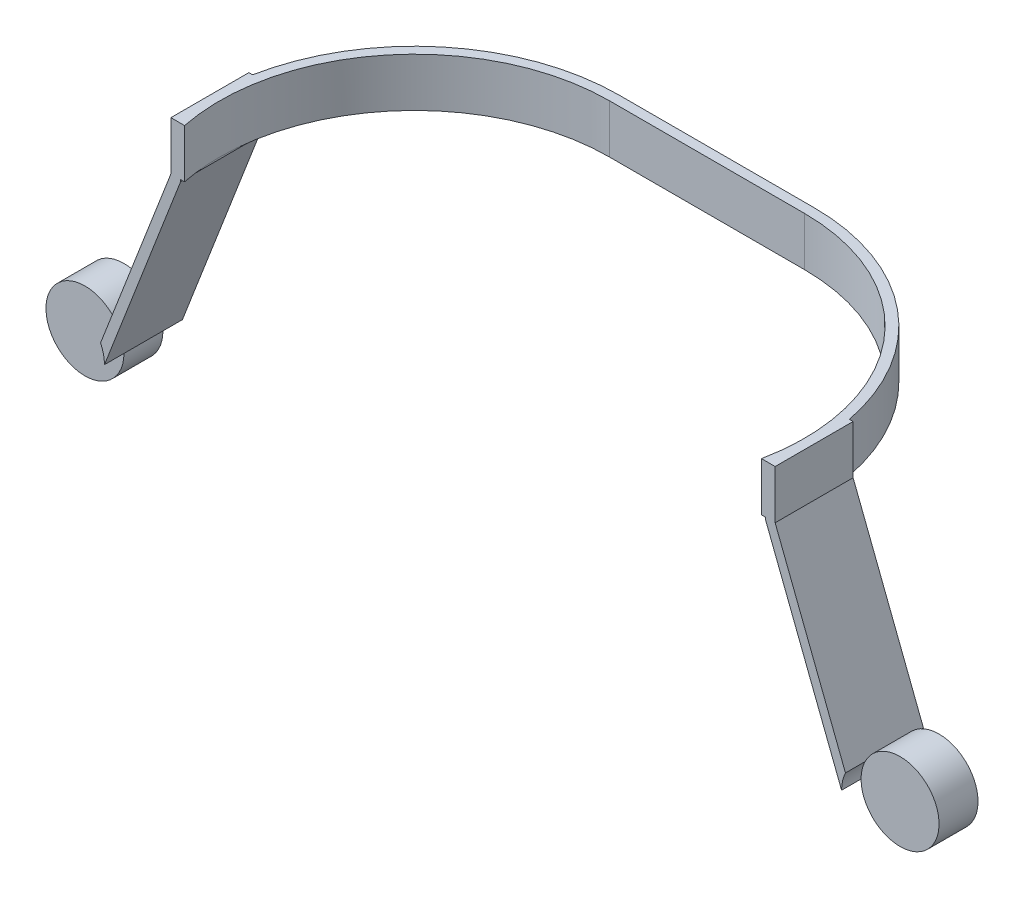
ISO-10303-21;
HEADER;
FILE_DESCRIPTION(('STEP AP214'),'2;1');
FILE_NAME('part.step','',(''),(''),'','','');
FILE_SCHEMA(('AUTOMOTIVE_DESIGN { 1 0 10303 214 1 1 1 1 }'));
ENDSEC;
DATA;
#1=APPLICATION_CONTEXT('core data for automotive mechanical design processes');
#2=APPLICATION_PROTOCOL_DEFINITION('international standard','automotive_design',2000,#1);
#3=PRODUCT_CONTEXT('',#1,'mechanical');
#4=PRODUCT('Part','Part','',(#3));
#5=PRODUCT_RELATED_PRODUCT_CATEGORY('part','',(#4));
#6=PRODUCT_DEFINITION_FORMATION('','',#4);
#7=PRODUCT_DEFINITION_CONTEXT('part definition',#1,'design');
#8=PRODUCT_DEFINITION('design','',#6,#7);
#9=PRODUCT_DEFINITION_SHAPE('','',#8);
#10=(LENGTH_UNIT() NAMED_UNIT(*) SI_UNIT(.MILLI.,.METRE.));
#11=(NAMED_UNIT(*) PLANE_ANGLE_UNIT() SI_UNIT($,.RADIAN.));
#12=(NAMED_UNIT(*) SI_UNIT($,.STERADIAN.) SOLID_ANGLE_UNIT());
#13=UNCERTAINTY_MEASURE_WITH_UNIT(LENGTH_MEASURE(1.E-05),#10,'distance_accuracy_value','');
#14=(GEOMETRIC_REPRESENTATION_CONTEXT(3) GLOBAL_UNCERTAINTY_ASSIGNED_CONTEXT((#13)) GLOBAL_UNIT_ASSIGNED_CONTEXT((#10,
#11,#12)) REPRESENTATION_CONTEXT('',''));
#15=CARTESIAN_POINT('',(0.,0.,0.));
#16=DIRECTION('',(0.,0.,1.));
#17=DIRECTION('',(1.,0.,0.));
#18=AXIS2_PLACEMENT_3D('',#15,#16,#17);
#19=CARTESIAN_POINT('',(-40.,0.,0.));
#20=DIRECTION('',(0.,1.,0.));
#21=DIRECTION('',(0.,0.,1.));
#22=AXIS2_PLACEMENT_3D('',#19,#20,#21);
#23=PLANE('',#22);
#24=DIRECTION('',(0.,0.,-1.));
#25=VECTOR('',#24,1.);
#26=CARTESIAN_POINT('',(120.,0.,0.));
#27=LINE('',#26,#25);
#28=CARTESIAN_POINT('',(120.,0.,16.));
#29=VERTEX_POINT('',#28);
#30=CARTESIAN_POINT('',(120.,0.,0.));
#31=VERTEX_POINT('',#30);
#32=EDGE_CURVE('E308',#29,#31,#27,.T.);
#33=ORIENTED_EDGE('',*,*,#32,.F.);
#34=DIRECTION('',(-1.,0.,0.));
#35=VECTOR('',#34,1.);
#36=CARTESIAN_POINT('',(-40.,0.,16.));
#37=LINE('',#36,#35);
#38=CARTESIAN_POINT('',(118.383671769062,0.,16.));
#39=VERTEX_POINT('',#38);
#40=EDGE_CURVE('E370',#29,#39,#37,.T.);
#41=ORIENTED_EDGE('',*,*,#40,.T.);
#42=CARTESIAN_POINT('',(40.,0.,0.));
#43=DIRECTION('',(0.,1.,0.));
#44=DIRECTION('',(0.,0.,1.));
#45=AXIS2_PLACEMENT_3D('',#42,#43,#44);
#46=CIRCLE('',#45,80.);
#47=EDGE_CURVE('E231',#39,#31,#46,.T.);
#48=ORIENTED_EDGE('',*,*,#47,.T.);
#49=EDGE_LOOP('',(#33,#41,#48));
#50=FACE_BOUND('',#49,.T.);
#51=ADVANCED_FACE('F34',(#50),#23,.F.);
#52=CARTESIAN_POINT('',(-167.270234139266,-81.4452842710347,-84.));
#53=DIRECTION('',(0.,0.,1.));
#54=DIRECTION('',(1.,0.,0.));
#55=AXIS2_PLACEMENT_3D('',#52,#53,#54);
#56=CYLINDRICAL_SURFACE('',#55,16.);
#57=CARTESIAN_POINT('',(-167.270234139266,-81.4452842710347,-8.));
#58=DIRECTION('',(0.,0.,1.));
#59=DIRECTION('',(1.,0.,0.));
#60=AXIS2_PLACEMENT_3D('',#57,#58,#59);
#61=CIRCLE('',#60,16.);
#62=CARTESIAN_POINT('',(-151.270234139266,-81.4452842710347,-8.));
#63=VERTEX_POINT('',#62);
#64=CARTESIAN_POINT('',(-152.863180848311,-74.4856279956423,-8.00000000000002));
#65=VERTEX_POINT('',#64);
#66=EDGE_CURVE('E379',#63,#65,#61,.T.);
#67=ORIENTED_EDGE('',*,*,#66,.T.);
#68=DIRECTION('',(0.,0.,1.));
#69=VECTOR('',#68,1.);
#70=CARTESIAN_POINT('',(-152.863180848311,-74.4856279956423,-84.));
#71=LINE('',#70,#69);
#72=CARTESIAN_POINT('',(-152.863180848311,-74.4856279956424,-16.));
#73=VERTEX_POINT('',#72);
#74=EDGE_CURVE('E399',#73,#65,#71,.T.);
#75=ORIENTED_EDGE('',*,*,#74,.F.);
#76=CARTESIAN_POINT('',(-167.270234139266,-81.4452842710347,-16.));
#77=DIRECTION('',(0.,0.,1.));
#78=DIRECTION('',(1.,0.,0.));
#79=AXIS2_PLACEMENT_3D('',#76,#77,#78);
#80=CIRCLE('',#79,16.);
#81=CARTESIAN_POINT('',(-151.270234139266,-81.4452842710347,-16.));
#82=VERTEX_POINT('',#81);
#83=EDGE_CURVE('E11',#82,#73,#80,.T.);
#84=ORIENTED_EDGE('',*,*,#83,.F.);
#85=DIRECTION('',(0.,0.,-1.));
#86=VECTOR('',#85,1.);
#87=CARTESIAN_POINT('',(-151.270234139266,-81.4452842710347,-16.));
#88=LINE('',#87,#86);
#89=EDGE_CURVE('E313',#63,#82,#88,.T.);
#90=ORIENTED_EDGE('',*,*,#89,.F.);
#91=EDGE_LOOP('',(#67,#75,#84,#90));
#92=FACE_BOUND('',#91,.T.);
#93=ADVANCED_FACE('F457',(#92),#56,.F.);
#94=CARTESIAN_POINT('',(167.270234139266,-81.4452842710347,-84.));
#95=DIRECTION('',(0.,0.,1.));
#96=DIRECTION('',(1.,0.,0.));
#97=AXIS2_PLACEMENT_3D('',#94,#95,#96);
#98=CYLINDRICAL_SURFACE('',#97,16.);
#99=CARTESIAN_POINT('',(167.270234139266,-81.4452842710347,-8.));
#100=DIRECTION('',(0.,0.,1.));
#101=DIRECTION('',(1.,0.,0.));
#102=AXIS2_PLACEMENT_3D('',#99,#100,#101);
#103=CIRCLE('',#102,16.);
#104=CARTESIAN_POINT('',(152.863180848311,-74.4856279956424,-8.));
#105=VERTEX_POINT('',#104);
#106=CARTESIAN_POINT('',(151.270234139266,-81.4452842710347,-7.99999999999999));
#107=VERTEX_POINT('',#106);
#108=EDGE_CURVE('E387',#105,#107,#103,.T.);
#109=ORIENTED_EDGE('',*,*,#108,.T.);
#110=DIRECTION('',(0.,0.,1.));
#111=VECTOR('',#110,1.);
#112=CARTESIAN_POINT('',(151.270234139266,-81.4452842710347,-16.));
#113=LINE('',#112,#111);
#114=CARTESIAN_POINT('',(151.270234139266,-81.4452842710347,-16.));
#115=VERTEX_POINT('',#114);
#116=EDGE_CURVE('E291',#115,#107,#113,.T.);
#117=ORIENTED_EDGE('',*,*,#116,.F.);
#118=CARTESIAN_POINT('',(167.270234139266,-81.4452842710347,-16.));
#119=DIRECTION('',(0.,0.,1.));
#120=DIRECTION('',(1.,0.,0.));
#121=AXIS2_PLACEMENT_3D('',#118,#119,#120);
#122=CIRCLE('',#121,16.);
#123=CARTESIAN_POINT('',(152.863180848311,-74.4856279956424,-16.));
#124=VERTEX_POINT('',#123);
#125=EDGE_CURVE('E42',#124,#115,#122,.T.);
#126=ORIENTED_EDGE('',*,*,#125,.F.);
#127=DIRECTION('',(0.,0.,1.));
#128=VECTOR('',#127,1.);
#129=CARTESIAN_POINT('',(152.863180848311,-74.4856279956424,-84.));
#130=LINE('',#129,#128);
#131=EDGE_CURVE('E392',#105,#124,#130,.F.);
#132=ORIENTED_EDGE('',*,*,#131,.F.);
#133=EDGE_LOOP('',(#109,#117,#126,#132));
#134=FACE_BOUND('',#133,.T.);
#135=ADVANCED_FACE('F463',(#134),#98,.F.);
#136=DIRECTION('',(1.,0.,0.));
#137=VECTOR('',#136,1.);
#138=CARTESIAN_POINT('',(-40.,0.,-16.));
#139=LINE('',#138,#137);
#140=CARTESIAN_POINT('',(120.,0.,-16.));
#141=VERTEX_POINT('',#140);
#142=CARTESIAN_POINT('',(122.462112512353,0.,-16.));
#143=VERTEX_POINT('',#142);
#144=EDGE_CURVE('E310',#141,#143,#139,.T.);
#145=ORIENTED_EDGE('',*,*,#144,.F.);
#146=EDGE_CURVE('E305',#31,#141,#27,.T.);
#147=ORIENTED_EDGE('',*,*,#146,.F.);
#148=CARTESIAN_POINT('',(40.,0.,-80.));
#149=VERTEX_POINT('',#148);
#150=EDGE_CURVE('E241',#31,#149,#46,.T.);
#151=ORIENTED_EDGE('',*,*,#150,.T.);
#152=DIRECTION('',(-1.,0.,0.));
#153=VECTOR('',#152,1.);
#154=CARTESIAN_POINT('',(-40.,0.,-80.));
#155=LINE('',#154,#153);
#156=CARTESIAN_POINT('',(-40.,0.,-80.));
#157=VERTEX_POINT('',#156);
#158=EDGE_CURVE('E226',#149,#157,#155,.T.);
#159=ORIENTED_EDGE('',*,*,#158,.T.);
#160=CARTESIAN_POINT('',(-40.,0.,0.));
#161=DIRECTION('',(0.,1.,0.));
#162=DIRECTION('',(0.,0.,1.));
#163=AXIS2_PLACEMENT_3D('',#160,#161,#162);
#164=CIRCLE('',#163,80.);
#165=CARTESIAN_POINT('',(-120.,0.,0.));
#166=VERTEX_POINT('',#165);
#167=EDGE_CURVE('E238',#157,#166,#164,.T.);
#168=ORIENTED_EDGE('',*,*,#167,.T.);
#169=DIRECTION('',(0.,0.,1.));
#170=VECTOR('',#169,1.);
#171=CARTESIAN_POINT('',(-120.,0.,0.));
#172=LINE('',#171,#170);
#173=CARTESIAN_POINT('',(-120.,0.,-16.));
#174=VERTEX_POINT('',#173);
#175=EDGE_CURVE('E349',#174,#166,#172,.T.);
#176=ORIENTED_EDGE('',*,*,#175,.F.);
#177=DIRECTION('',(1.,0.,0.));
#178=VECTOR('',#177,1.);
#179=CARTESIAN_POINT('',(-40.,0.,-15.9999999999999));
#180=LINE('',#179,#178);
#181=CARTESIAN_POINT('',(-122.462112512353,0.,-16.));
#182=VERTEX_POINT('',#181);
#183=EDGE_CURVE('E234',#182,#174,#180,.T.);
#184=ORIENTED_EDGE('',*,*,#183,.F.);
#185=CARTESIAN_POINT('',(-40.,0.,0.));
#186=DIRECTION('',(0.,1.,0.));
#187=DIRECTION('',(0.,0.,1.));
#188=AXIS2_PLACEMENT_3D('',#185,#186,#187);
#189=CIRCLE('',#188,84.);
#190=CARTESIAN_POINT('',(-40.,0.,-84.));
#191=VERTEX_POINT('',#190);
#192=EDGE_CURVE('E248',#191,#182,#189,.T.);
#193=ORIENTED_EDGE('',*,*,#192,.F.);
#194=DIRECTION('',(-1.,0.,0.));
#195=VECTOR('',#194,1.);
#196=CARTESIAN_POINT('',(-40.,0.,-84.));
#197=LINE('',#196,#195);
#198=CARTESIAN_POINT('',(40.,0.,-84.));
#199=VERTEX_POINT('',#198);
#200=EDGE_CURVE('E253',#199,#191,#197,.T.);
#201=ORIENTED_EDGE('',*,*,#200,.F.);
#202=CARTESIAN_POINT('',(40.,0.,0.));
#203=DIRECTION('',(0.,1.,0.));
#204=DIRECTION('',(0.,0.,1.));
#205=AXIS2_PLACEMENT_3D('',#202,#203,#204);
#206=CIRCLE('',#205,84.);
#207=EDGE_CURVE('E260',#143,#199,#206,.T.);
#208=ORIENTED_EDGE('',*,*,#207,.F.);
#209=EDGE_LOOP('',(#145,#147,#151,#159,#168,#176,#184,#193,#201,#208));
#210=FACE_BOUND('',#209,.T.);
#211=ADVANCED_FACE('F358',(#210),#23,.F.);
#212=CARTESIAN_POINT('',(-118.383671769062,0.,16.));
#213=VERTEX_POINT('',#212);
#214=EDGE_CURVE('E242',#166,#213,#164,.T.);
#215=ORIENTED_EDGE('',*,*,#214,.T.);
#216=CARTESIAN_POINT('',(-120.,0.,16.));
#217=VERTEX_POINT('',#216);
#218=EDGE_CURVE('E49',#213,#217,#37,.T.);
#219=ORIENTED_EDGE('',*,*,#218,.T.);
#220=EDGE_CURVE('E317',#166,#217,#172,.T.);
#221=ORIENTED_EDGE('',*,*,#220,.F.);
#222=EDGE_LOOP('',(#215,#219,#221));
#223=FACE_BOUND('',#222,.T.);
#224=ADVANCED_FACE('F356',(#223),#23,.F.);
#225=CARTESIAN_POINT('',(40.,20.,0.));
#226=DIRECTION('',(0.,-1.,0.));
#227=DIRECTION('',(0.,0.,-1.));
#228=AXIS2_PLACEMENT_3D('',#225,#226,#227);
#229=CYLINDRICAL_SURFACE('',#228,84.);
#230=DIRECTION('',(0.,-1.,0.));
#231=VECTOR('',#230,1.);
#232=CARTESIAN_POINT('',(122.462112512353,20.,-16.));
#233=LINE('',#232,#231);
#234=CARTESIAN_POINT('',(122.462112512353,20.,-16.));
#235=VERTEX_POINT('',#234);
#236=EDGE_CURVE('E271',#143,#235,#233,.F.);
#237=ORIENTED_EDGE('',*,*,#236,.F.);
#238=ORIENTED_EDGE('',*,*,#207,.T.);
#239=DIRECTION('',(0.,-1.,0.));
#240=VECTOR('',#239,1.);
#241=CARTESIAN_POINT('',(40.,20.,-84.));
#242=LINE('',#241,#240);
#243=CARTESIAN_POINT('',(40.,20.,-84.));
#244=VERTEX_POINT('',#243);
#245=EDGE_CURVE('E265',#244,#199,#242,.T.);
#246=ORIENTED_EDGE('',*,*,#245,.F.);
#247=CARTESIAN_POINT('',(40.,20.,0.));
#248=DIRECTION('',(0.,1.,0.));
#249=DIRECTION('',(0.,0.,1.));
#250=AXIS2_PLACEMENT_3D('',#247,#248,#249);
#251=CIRCLE('',#250,84.);
#252=EDGE_CURVE('E252',#235,#244,#251,.T.);
#253=ORIENTED_EDGE('',*,*,#252,.F.);
#254=EDGE_LOOP('',(#237,#238,#246,#253));
#255=FACE_BOUND('',#254,.T.);
#256=ADVANCED_FACE('F470',(#255),#229,.T.);
#257=CARTESIAN_POINT('',(-40.,20.,0.));
#258=DIRECTION('',(0.,-1.,0.));
#259=DIRECTION('',(0.,0.,-1.));
#260=AXIS2_PLACEMENT_3D('',#257,#258,#259);
#261=CYLINDRICAL_SURFACE('',#260,84.);
#262=DIRECTION('',(0.,-1.,0.));
#263=VECTOR('',#262,1.);
#264=CARTESIAN_POINT('',(-122.462112512353,20.,-16.));
#265=LINE('',#264,#263);
#266=CARTESIAN_POINT('',(-122.462112512353,20.,-16.));
#267=VERTEX_POINT('',#266);
#268=EDGE_CURVE('E268',#267,#182,#265,.T.);
#269=ORIENTED_EDGE('',*,*,#268,.F.);
#270=CARTESIAN_POINT('',(-40.,20.,0.));
#271=DIRECTION('',(0.,1.,0.));
#272=DIRECTION('',(0.,0.,1.));
#273=AXIS2_PLACEMENT_3D('',#270,#271,#272);
#274=CIRCLE('',#273,84.);
#275=CARTESIAN_POINT('',(-40.,20.,-84.));
#276=VERTEX_POINT('',#275);
#277=EDGE_CURVE('E249',#276,#267,#274,.T.);
#278=ORIENTED_EDGE('',*,*,#277,.F.);
#279=DIRECTION('',(0.,-1.,0.));
#280=VECTOR('',#279,1.);
#281=CARTESIAN_POINT('',(-40.,20.,-84.));
#282=LINE('',#281,#280);
#283=EDGE_CURVE('E257',#276,#191,#282,.T.);
#284=ORIENTED_EDGE('',*,*,#283,.T.);
#285=ORIENTED_EDGE('',*,*,#192,.T.);
#286=EDGE_LOOP('',(#269,#278,#284,#285));
#287=FACE_BOUND('',#286,.T.);
#288=ADVANCED_FACE('F36',(#287),#261,.T.);
#289=CARTESIAN_POINT('',(-40.,20.,0.));
#290=DIRECTION('',(0.,1.,0.));
#291=DIRECTION('',(0.,0.,1.));
#292=AXIS2_PLACEMENT_3D('',#289,#290,#291);
#293=PLANE('',#292);
#294=CARTESIAN_POINT('',(40.,20.,0.));
#295=DIRECTION('',(0.,1.,0.));
#296=DIRECTION('',(0.,0.,1.));
#297=AXIS2_PLACEMENT_3D('',#294,#295,#296);
#298=CIRCLE('',#297,80.);
#299=CARTESIAN_POINT('',(118.383671769062,20.,16.));
#300=VERTEX_POINT('',#299);
#301=CARTESIAN_POINT('',(40.,20.,-80.));
#302=VERTEX_POINT('',#301);
#303=EDGE_CURVE('E225',#300,#302,#298,.T.);
#304=ORIENTED_EDGE('',*,*,#303,.F.);
#305=DIRECTION('',(1.,0.,0.));
#306=VECTOR('',#305,1.);
#307=CARTESIAN_POINT('',(124.,20.,16.));
#308=LINE('',#307,#306);
#309=CARTESIAN_POINT('',(124.,20.,16.));
#310=VERTEX_POINT('',#309);
#311=EDGE_CURVE('E57',#300,#310,#308,.T.);
#312=ORIENTED_EDGE('',*,*,#311,.T.);
#313=DIRECTION('',(0.,0.,-1.));
#314=VECTOR('',#313,1.);
#315=CARTESIAN_POINT('',(124.,20.,-16.));
#316=LINE('',#315,#314);
#317=CARTESIAN_POINT('',(124.,20.,-16.));
#318=VERTEX_POINT('',#317);
#319=EDGE_CURVE('E298',#310,#318,#316,.T.);
#320=ORIENTED_EDGE('',*,*,#319,.T.);
#321=DIRECTION('',(-1.,0.,0.));
#322=VECTOR('',#321,1.);
#323=CARTESIAN_POINT('',(124.,20.,-16.));
#324=LINE('',#323,#322);
#325=EDGE_CURVE('E411',#318,#235,#324,.T.);
#326=ORIENTED_EDGE('',*,*,#325,.T.);
#327=ORIENTED_EDGE('',*,*,#252,.T.);
#328=DIRECTION('',(-1.,0.,0.));
#329=VECTOR('',#328,1.);
#330=CARTESIAN_POINT('',(-40.,20.,-84.));
#331=LINE('',#330,#329);
#332=EDGE_CURVE('E255',#244,#276,#331,.T.);
#333=ORIENTED_EDGE('',*,*,#332,.T.);
#334=ORIENTED_EDGE('',*,*,#277,.T.);
#335=DIRECTION('',(-1.,0.,0.));
#336=VECTOR('',#335,1.);
#337=CARTESIAN_POINT('',(-124.,20.,-16.));
#338=LINE('',#337,#336);
#339=CARTESIAN_POINT('',(-124.,20.,-16.));
#340=VERTEX_POINT('',#339);
#341=EDGE_CURVE('E212',#267,#340,#338,.T.);
#342=ORIENTED_EDGE('',*,*,#341,.T.);
#343=DIRECTION('',(0.,0.,1.));
#344=VECTOR('',#343,1.);
#345=CARTESIAN_POINT('',(-124.,20.,-16.));
#346=LINE('',#345,#344);
#347=CARTESIAN_POINT('',(-124.,20.,16.));
#348=VERTEX_POINT('',#347);
#349=EDGE_CURVE('E209',#340,#348,#346,.T.);
#350=ORIENTED_EDGE('',*,*,#349,.T.);
#351=DIRECTION('',(1.,0.,0.));
#352=VECTOR('',#351,1.);
#353=CARTESIAN_POINT('',(-124.,20.,16.));
#354=LINE('',#353,#352);
#355=CARTESIAN_POINT('',(-118.383671769062,20.,16.));
#356=VERTEX_POINT('',#355);
#357=EDGE_CURVE('E202',#348,#356,#354,.T.);
#358=ORIENTED_EDGE('',*,*,#357,.T.);
#359=CARTESIAN_POINT('',(-40.,20.,0.));
#360=DIRECTION('',(0.,1.,0.));
#361=DIRECTION('',(0.,0.,1.));
#362=AXIS2_PLACEMENT_3D('',#359,#360,#361);
#363=CIRCLE('',#362,80.);
#364=CARTESIAN_POINT('',(-40.,20.,-80.));
#365=VERTEX_POINT('',#364);
#366=EDGE_CURVE('E207',#365,#356,#363,.T.);
#367=ORIENTED_EDGE('',*,*,#366,.F.);
#368=DIRECTION('',(-1.,0.,0.));
#369=VECTOR('',#368,1.);
#370=CARTESIAN_POINT('',(-40.,20.,-80.));
#371=LINE('',#370,#369);
#372=EDGE_CURVE('E228',#302,#365,#371,.T.);
#373=ORIENTED_EDGE('',*,*,#372,.F.);
#374=EDGE_LOOP('',(#304,#312,#320,#326,#327,#333,#334,#342,#350,#358,#367,#373));
#375=FACE_BOUND('',#374,.T.);
#376=ADVANCED_FACE('F204',(#375),#293,.T.);
#377=CARTESIAN_POINT('',(-40.,20.,-84.));
#378=DIRECTION('',(0.,0.,1.));
#379=DIRECTION('',(1.,0.,0.));
#380=AXIS2_PLACEMENT_3D('',#377,#378,#379);
#381=PLANE('',#380);
#382=ORIENTED_EDGE('',*,*,#200,.T.);
#383=ORIENTED_EDGE('',*,*,#283,.F.);
#384=ORIENTED_EDGE('',*,*,#332,.F.);
#385=ORIENTED_EDGE('',*,*,#245,.T.);
#386=EDGE_LOOP('',(#382,#383,#384,#385));
#387=FACE_BOUND('',#386,.T.);
#388=ADVANCED_FACE('F528',(#387),#381,.F.);
#389=CARTESIAN_POINT('',(-40.,20.,0.));
#390=DIRECTION('',(0.,-1.,0.));
#391=DIRECTION('',(0.,0.,-1.));
#392=AXIS2_PLACEMENT_3D('',#389,#390,#391);
#393=CYLINDRICAL_SURFACE('',#392,80.);
#394=DIRECTION('',(0.,-1.,0.));
#395=VECTOR('',#394,1.);
#396=CARTESIAN_POINT('',(-118.383671769062,20.,16.));
#397=LINE('',#396,#395);
#398=EDGE_CURVE('E214',#213,#356,#397,.F.);
#399=ORIENTED_EDGE('',*,*,#398,.F.);
#400=ORIENTED_EDGE('',*,*,#214,.F.);
#401=ORIENTED_EDGE('',*,*,#167,.F.);
#402=DIRECTION('',(0.,-1.,0.));
#403=VECTOR('',#402,1.);
#404=CARTESIAN_POINT('',(-40.,20.,-80.));
#405=LINE('',#404,#403);
#406=EDGE_CURVE('E224',#365,#157,#405,.T.);
#407=ORIENTED_EDGE('',*,*,#406,.F.);
#408=ORIENTED_EDGE('',*,*,#366,.T.);
#409=EDGE_LOOP('',(#399,#400,#401,#407,#408));
#410=FACE_BOUND('',#409,.T.);
#411=ADVANCED_FACE('F222',(#410),#393,.F.);
#412=CARTESIAN_POINT('',(40.,20.,0.));
#413=DIRECTION('',(0.,-1.,0.));
#414=DIRECTION('',(0.,0.,-1.));
#415=AXIS2_PLACEMENT_3D('',#412,#413,#414);
#416=CYLINDRICAL_SURFACE('',#415,80.);
#417=DIRECTION('',(0.,-1.,0.));
#418=VECTOR('',#417,1.);
#419=CARTESIAN_POINT('',(118.383671769062,20.,16.));
#420=LINE('',#419,#418);
#421=EDGE_CURVE('E219',#300,#39,#420,.T.);
#422=ORIENTED_EDGE('',*,*,#421,.F.);
#423=ORIENTED_EDGE('',*,*,#303,.T.);
#424=DIRECTION('',(0.,-1.,0.));
#425=VECTOR('',#424,1.);
#426=CARTESIAN_POINT('',(40.,20.,-80.));
#427=LINE('',#426,#425);
#428=EDGE_CURVE('E245',#302,#149,#427,.T.);
#429=ORIENTED_EDGE('',*,*,#428,.T.);
#430=ORIENTED_EDGE('',*,*,#150,.F.);
#431=ORIENTED_EDGE('',*,*,#47,.F.);
#432=EDGE_LOOP('',(#422,#423,#429,#430,#431));
#433=FACE_BOUND('',#432,.T.);
#434=ADVANCED_FACE('F367',(#433),#416,.F.);
#435=CARTESIAN_POINT('',(-40.,20.,-80.));
#436=DIRECTION('',(0.,0.,1.));
#437=DIRECTION('',(1.,0.,0.));
#438=AXIS2_PLACEMENT_3D('',#435,#436,#437);
#439=PLANE('',#438);
#440=ORIENTED_EDGE('',*,*,#158,.F.);
#441=ORIENTED_EDGE('',*,*,#428,.F.);
#442=ORIENTED_EDGE('',*,*,#372,.T.);
#443=ORIENTED_EDGE('',*,*,#406,.T.);
#444=EDGE_LOOP('',(#440,#441,#442,#443));
#445=FACE_BOUND('',#444,.T.);
#446=ADVANCED_FACE('F364',(#445),#439,.T.);
#447=CARTESIAN_POINT('',(-124.,20.,-16.));
#448=DIRECTION('',(0.,0.,1.));
#449=DIRECTION('',(1.,0.,0.));
#450=AXIS2_PLACEMENT_3D('',#447,#448,#449);
#451=PLANE('',#450);
#452=ORIENTED_EDGE('',*,*,#268,.T.);
#453=ORIENTED_EDGE('',*,*,#183,.T.);
#454=DIRECTION('',(0.,-1.,0.));
#455=VECTOR('',#454,1.);
#456=CARTESIAN_POINT('',(-120.,20.,-16.));
#457=LINE('',#456,#455);
#458=CARTESIAN_POINT('',(-120.,-0.747905847123431,-16.));
#459=VERTEX_POINT('',#458);
#460=EDGE_CURVE('E331',#174,#459,#457,.T.);
#461=ORIENTED_EDGE('',*,*,#460,.T.);
#462=DIRECTION('',(0.982965275374366,-0.183791369242945,0.));
#463=VECTOR('',#462,1.);
#464=CARTESIAN_POINT('',(-127.613210677586,0.675585348163935,-16.));
#465=LINE('',#464,#463);
#466=CARTESIAN_POINT('',(-124.,0.,-16.));
#467=VERTEX_POINT('',#466);
#468=EDGE_CURVE('E318',#467,#459,#465,.T.);
#469=ORIENTED_EDGE('',*,*,#468,.F.);
#470=DIRECTION('',(0.,-1.,0.));
#471=VECTOR('',#470,1.);
#472=CARTESIAN_POINT('',(-124.,20.,-16.));
#473=LINE('',#472,#471);
#474=EDGE_CURVE('E327',#340,#467,#473,.T.);
#475=ORIENTED_EDGE('',*,*,#474,.F.);
#476=ORIENTED_EDGE('',*,*,#341,.F.);
#477=EDGE_LOOP('',(#452,#453,#461,#469,#475,#476));
#478=FACE_BOUND('',#477,.T.);
#479=ADVANCED_FACE('F506',(#478),#451,.F.);
#480=CARTESIAN_POINT('',(-124.,20.,16.));
#481=DIRECTION('',(0.,0.,-1.));
#482=DIRECTION('',(-1.,0.,0.));
#483=AXIS2_PLACEMENT_3D('',#480,#481,#482);
#484=PLANE('',#483);
#485=DIRECTION('',(0.,-1.,0.));
#486=VECTOR('',#485,1.);
#487=CARTESIAN_POINT('',(-120.,20.,16.));
#488=LINE('',#487,#486);
#489=CARTESIAN_POINT('',(-120.,-0.747905847123431,16.));
#490=VERTEX_POINT('',#489);
#491=EDGE_CURVE('E326',#217,#490,#488,.T.);
#492=ORIENTED_EDGE('',*,*,#491,.F.);
#493=ORIENTED_EDGE('',*,*,#218,.F.);
#494=ORIENTED_EDGE('',*,*,#398,.T.);
#495=ORIENTED_EDGE('',*,*,#357,.F.);
#496=DIRECTION('',(0.,-1.,0.));
#497=VECTOR('',#496,1.);
#498=CARTESIAN_POINT('',(-124.,20.,16.));
#499=LINE('',#498,#497);
#500=CARTESIAN_POINT('',(-124.,0.,16.));
#501=VERTEX_POINT('',#500);
#502=EDGE_CURVE('E324',#348,#501,#499,.T.);
#503=ORIENTED_EDGE('',*,*,#502,.T.);
#504=DIRECTION('',(-0.361321067758647,-0.932441465183607,0.));
#505=VECTOR('',#504,1.);
#506=CARTESIAN_POINT('',(-123.666610340032,0.860360412820629,16.));
#507=LINE('',#506,#505);
#508=CARTESIAN_POINT('',(-152.863180848311,-74.4856279956424,16.));
#509=VERTEX_POINT('',#508);
#510=EDGE_CURVE('E344',#501,#509,#507,.T.);
#511=ORIENTED_EDGE('',*,*,#510,.T.);
#512=CARTESIAN_POINT('',(-167.270234139266,-81.4452842710347,16.));
#513=DIRECTION('',(0.,0.,1.));
#514=DIRECTION('',(1.,0.,0.));
#515=AXIS2_PLACEMENT_3D('',#512,#513,#514);
#516=CIRCLE('',#515,16.);
#517=CARTESIAN_POINT('',(-151.270234139266,-81.4452842710347,16.));
#518=VERTEX_POINT('',#517);
#519=EDGE_CURVE('E389',#518,#509,#516,.T.);
#520=ORIENTED_EDGE('',*,*,#519,.F.);
#521=DIRECTION('',(-0.361321067758647,-0.932441465183607,0.));
#522=VECTOR('',#521,1.);
#523=CARTESIAN_POINT('',(-119.936844479298,-0.584923858213959,16.));
#524=LINE('',#523,#522);
#525=EDGE_CURVE('E342',#490,#518,#524,.T.);
#526=ORIENTED_EDGE('',*,*,#525,.F.);
#527=EDGE_LOOP('',(#492,#493,#494,#495,#503,#511,#520,#526));
#528=FACE_BOUND('',#527,.T.);
#529=ADVANCED_FACE('F215',(#528),#484,.F.);
#530=CARTESIAN_POINT('',(-124.,20.,-16.));
#531=DIRECTION('',(1.,0.,0.));
#532=DIRECTION('',(0.,0.,-1.));
#533=AXIS2_PLACEMENT_3D('',#530,#531,#532);
#534=PLANE('',#533);
#535=ORIENTED_EDGE('',*,*,#502,.F.);
#536=ORIENTED_EDGE('',*,*,#349,.F.);
#537=ORIENTED_EDGE('',*,*,#474,.T.);
#538=DIRECTION('',(0.,0.,-1.));
#539=VECTOR('',#538,1.);
#540=CARTESIAN_POINT('',(-124.,0.,-16.));
#541=LINE('',#540,#539);
#542=EDGE_CURVE('E321',#501,#467,#541,.T.);
#543=ORIENTED_EDGE('',*,*,#542,.F.);
#544=EDGE_LOOP('',(#535,#536,#537,#543));
#545=FACE_BOUND('',#544,.T.);
#546=ADVANCED_FACE('F499',(#545),#534,.F.);
#547=CARTESIAN_POINT('',(-120.,20.,-16.));
#548=DIRECTION('',(-1.,0.,0.));
#549=DIRECTION('',(0.,0.,1.));
#550=AXIS2_PLACEMENT_3D('',#547,#548,#549);
#551=PLANE('',#550);
#552=ORIENTED_EDGE('',*,*,#460,.F.);
#553=ORIENTED_EDGE('',*,*,#175,.T.);
#554=ORIENTED_EDGE('',*,*,#220,.T.);
#555=ORIENTED_EDGE('',*,*,#491,.T.);
#556=DIRECTION('',(0.,0.,1.));
#557=VECTOR('',#556,1.);
#558=CARTESIAN_POINT('',(-120.,-0.747905847123431,-16.));
#559=LINE('',#558,#557);
#560=EDGE_CURVE('E314',#459,#490,#559,.T.);
#561=ORIENTED_EDGE('',*,*,#560,.F.);
#562=EDGE_LOOP('',(#552,#553,#554,#555,#561));
#563=FACE_BOUND('',#562,.T.);
#564=ADVANCED_FACE('F502',(#563),#551,.F.);
#565=CARTESIAN_POINT('',(-123.666610340032,0.860360412820629,-16.));
#566=DIRECTION('',(0.932441465183607,-0.361321067758647,0.));
#567=DIRECTION('',(0.361321067758647,0.932441465183607,0.));
#568=AXIS2_PLACEMENT_3D('',#565,#566,#567);
#569=PLANE('',#568);
#570=DIRECTION('',(-0.361321067758647,-0.932441465183607,0.));
#571=VECTOR('',#570,1.);
#572=CARTESIAN_POINT('',(-123.666610340032,0.860360412820629,-16.));
#573=LINE('',#572,#571);
#574=EDGE_CURVE('E323',#467,#73,#573,.T.);
#575=ORIENTED_EDGE('',*,*,#574,.T.);
#576=ORIENTED_EDGE('',*,*,#74,.T.);
#577=CARTESIAN_POINT('',(-152.863180848311,-74.4856279956423,7.99999999999997));
#578=VERTEX_POINT('',#577);
#579=EDGE_CURVE('E403',#65,#578,#71,.T.);
#580=ORIENTED_EDGE('',*,*,#579,.T.);
#581=EDGE_CURVE('E397',#578,#509,#71,.T.);
#582=ORIENTED_EDGE('',*,*,#581,.T.);
#583=ORIENTED_EDGE('',*,*,#510,.F.);
#584=ORIENTED_EDGE('',*,*,#542,.T.);
#585=EDGE_LOOP('',(#575,#576,#580,#582,#583,#584));
#586=FACE_BOUND('',#585,.T.);
#587=ADVANCED_FACE('F509',(#586),#569,.F.);
#588=CARTESIAN_POINT('',(-119.936844479298,-0.584923858213959,-16.));
#589=DIRECTION('',(-0.932441465183607,0.361321067758647,0.));
#590=DIRECTION('',(-0.361321067758647,-0.932441465183607,0.));
#591=AXIS2_PLACEMENT_3D('',#588,#589,#590);
#592=PLANE('',#591);
#593=ORIENTED_EDGE('',*,*,#560,.T.);
#594=ORIENTED_EDGE('',*,*,#525,.T.);
#595=CARTESIAN_POINT('',(-151.270234139266,-81.4452842710347,7.99999999999999));
#596=VERTEX_POINT('',#595);
#597=EDGE_CURVE('E335',#518,#596,#88,.T.);
#598=ORIENTED_EDGE('',*,*,#597,.T.);
#599=EDGE_CURVE('E339',#596,#63,#88,.T.);
#600=ORIENTED_EDGE('',*,*,#599,.T.);
#601=ORIENTED_EDGE('',*,*,#89,.T.);
#602=DIRECTION('',(-0.361321067758647,-0.932441465183607,0.));
#603=VECTOR('',#602,1.);
#604=CARTESIAN_POINT('',(-119.936844479298,-0.584923858213959,-16.));
#605=LINE('',#604,#603);
#606=EDGE_CURVE('E338',#459,#82,#605,.T.);
#607=ORIENTED_EDGE('',*,*,#606,.F.);
#608=EDGE_LOOP('',(#593,#594,#598,#600,#601,#607));
#609=FACE_BOUND('',#608,.T.);
#610=ADVANCED_FACE('F515',(#609),#592,.F.);
#611=CARTESIAN_POINT('',(-123.666610340032,0.860360412820629,-16.));
#612=DIRECTION('',(0.,0.,1.));
#613=DIRECTION('',(1.,0.,0.));
#614=AXIS2_PLACEMENT_3D('',#611,#612,#613);
#615=PLANE('',#614);
#616=ORIENTED_EDGE('',*,*,#606,.T.);
#617=ORIENTED_EDGE('',*,*,#83,.T.);
#618=ORIENTED_EDGE('',*,*,#574,.F.);
#619=ORIENTED_EDGE('',*,*,#468,.T.);
#620=EDGE_LOOP('',(#616,#617,#618,#619));
#621=FACE_BOUND('',#620,.T.);
#622=ADVANCED_FACE('F510',(#621),#615,.F.);
#623=CARTESIAN_POINT('',(124.,20.,-16.));
#624=DIRECTION('',(0.,0.,1.));
#625=DIRECTION('',(1.,0.,0.));
#626=AXIS2_PLACEMENT_3D('',#623,#624,#625);
#627=PLANE('',#626);
#628=DIRECTION('',(0.,-1.,0.));
#629=VECTOR('',#628,1.);
#630=CARTESIAN_POINT('',(120.,20.,-16.));
#631=LINE('',#630,#629);
#632=CARTESIAN_POINT('',(120.,-0.747905847123431,-16.));
#633=VERTEX_POINT('',#632);
#634=EDGE_CURVE('E410',#141,#633,#631,.T.);
#635=ORIENTED_EDGE('',*,*,#634,.F.);
#636=ORIENTED_EDGE('',*,*,#144,.T.);
#637=ORIENTED_EDGE('',*,*,#236,.T.);
#638=ORIENTED_EDGE('',*,*,#325,.F.);
#639=DIRECTION('',(0.,-1.,0.));
#640=VECTOR('',#639,1.);
#641=CARTESIAN_POINT('',(124.,20.,-16.));
#642=LINE('',#641,#640);
#643=CARTESIAN_POINT('',(124.,0.,-16.));
#644=VERTEX_POINT('',#643);
#645=EDGE_CURVE('E415',#318,#644,#642,.T.);
#646=ORIENTED_EDGE('',*,*,#645,.T.);
#647=DIRECTION('',(0.982965275374366,0.183791369242945,0.));
#648=VECTOR('',#647,1.);
#649=CARTESIAN_POINT('',(127.613210677586,0.675585348163935,-16.));
#650=LINE('',#649,#648);
#651=EDGE_CURVE('E405',#633,#644,#650,.T.);
#652=ORIENTED_EDGE('',*,*,#651,.F.);
#653=EDGE_LOOP('',(#635,#636,#637,#638,#646,#652));
#654=FACE_BOUND('',#653,.T.);
#655=ADVANCED_FACE('F496',(#654),#627,.F.);
#656=CARTESIAN_POINT('',(124.,20.,-16.));
#657=DIRECTION('',(-1.,0.,0.));
#658=DIRECTION('',(0.,0.,1.));
#659=AXIS2_PLACEMENT_3D('',#656,#657,#658);
#660=PLANE('',#659);
#661=ORIENTED_EDGE('',*,*,#645,.F.);
#662=ORIENTED_EDGE('',*,*,#319,.F.);
#663=DIRECTION('',(0.,-1.,0.));
#664=VECTOR('',#663,1.);
#665=CARTESIAN_POINT('',(124.,20.,16.));
#666=LINE('',#665,#664);
#667=CARTESIAN_POINT('',(124.,0.,16.));
#668=VERTEX_POINT('',#667);
#669=EDGE_CURVE('E409',#310,#668,#666,.T.);
#670=ORIENTED_EDGE('',*,*,#669,.T.);
#671=DIRECTION('',(0.,0.,1.));
#672=VECTOR('',#671,1.);
#673=CARTESIAN_POINT('',(124.,0.,-16.));
#674=LINE('',#673,#672);
#675=EDGE_CURVE('E309',#644,#668,#674,.T.);
#676=ORIENTED_EDGE('',*,*,#675,.F.);
#677=EDGE_LOOP('',(#661,#662,#670,#676));
#678=FACE_BOUND('',#677,.T.);
#679=ADVANCED_FACE('F639',(#678),#660,.F.);
#680=CARTESIAN_POINT('',(124.,20.,16.));
#681=DIRECTION('',(0.,0.,-1.));
#682=DIRECTION('',(-1.,0.,0.));
#683=AXIS2_PLACEMENT_3D('',#680,#681,#682);
#684=PLANE('',#683);
#685=ORIENTED_EDGE('',*,*,#40,.F.);
#686=DIRECTION('',(0.,-1.,0.));
#687=VECTOR('',#686,1.);
#688=CARTESIAN_POINT('',(120.,20.,16.));
#689=LINE('',#688,#687);
#690=CARTESIAN_POINT('',(120.,-0.747905847123431,16.));
#691=VERTEX_POINT('',#690);
#692=EDGE_CURVE('E407',#29,#691,#689,.T.);
#693=ORIENTED_EDGE('',*,*,#692,.T.);
#694=DIRECTION('',(0.361321067758647,-0.932441465183607,0.));
#695=VECTOR('',#694,1.);
#696=CARTESIAN_POINT('',(119.936844479298,-0.584923858213959,16.));
#697=LINE('',#696,#695);
#698=CARTESIAN_POINT('',(151.270234139266,-81.4452842710347,16.));
#699=VERTEX_POINT('',#698);
#700=EDGE_CURVE('E296',#691,#699,#697,.T.);
#701=ORIENTED_EDGE('',*,*,#700,.T.);
#702=CARTESIAN_POINT('',(167.270234139266,-81.4452842710347,16.));
#703=DIRECTION('',(0.,0.,1.));
#704=DIRECTION('',(1.,0.,0.));
#705=AXIS2_PLACEMENT_3D('',#702,#703,#704);
#706=CIRCLE('',#705,16.);
#707=CARTESIAN_POINT('',(152.863180848311,-74.4856279956424,16.));
#708=VERTEX_POINT('',#707);
#709=EDGE_CURVE('E385',#708,#699,#706,.T.);
#710=ORIENTED_EDGE('',*,*,#709,.F.);
#711=DIRECTION('',(0.361321067758647,-0.932441465183607,0.));
#712=VECTOR('',#711,1.);
#713=CARTESIAN_POINT('',(123.666610340032,0.860360412820629,16.));
#714=LINE('',#713,#712);
#715=EDGE_CURVE('E301',#668,#708,#714,.T.);
#716=ORIENTED_EDGE('',*,*,#715,.F.);
#717=ORIENTED_EDGE('',*,*,#669,.F.);
#718=ORIENTED_EDGE('',*,*,#311,.F.);
#719=ORIENTED_EDGE('',*,*,#421,.T.);
#720=EDGE_LOOP('',(#685,#693,#701,#710,#716,#717,#718,#719));
#721=FACE_BOUND('',#720,.T.);
#722=ADVANCED_FACE('F433',(#721),#684,.F.);
#723=CARTESIAN_POINT('',(120.,20.,-16.));
#724=DIRECTION('',(1.,0.,0.));
#725=DIRECTION('',(0.,0.,-1.));
#726=AXIS2_PLACEMENT_3D('',#723,#724,#725);
#727=PLANE('',#726);
#728=ORIENTED_EDGE('',*,*,#692,.F.);
#729=ORIENTED_EDGE('',*,*,#32,.T.);
#730=ORIENTED_EDGE('',*,*,#146,.T.);
#731=ORIENTED_EDGE('',*,*,#634,.T.);
#732=DIRECTION('',(0.,0.,-1.));
#733=VECTOR('',#732,1.);
#734=CARTESIAN_POINT('',(120.,-0.747905847123431,-16.));
#735=LINE('',#734,#733);
#736=EDGE_CURVE('E295',#691,#633,#735,.T.);
#737=ORIENTED_EDGE('',*,*,#736,.F.);
#738=EDGE_LOOP('',(#728,#729,#730,#731,#737));
#739=FACE_BOUND('',#738,.T.);
#740=ADVANCED_FACE('F486',(#739),#727,.F.);
#741=CARTESIAN_POINT('',(119.936844479298,-0.584923858213959,-16.));
#742=DIRECTION('',(0.932441465183607,0.361321067758647,0.));
#743=DIRECTION('',(-0.361321067758647,0.932441465183607,0.));
#744=AXIS2_PLACEMENT_3D('',#741,#742,#743);
#745=PLANE('',#744);
#746=ORIENTED_EDGE('',*,*,#736,.T.);
#747=DIRECTION('',(0.361321067758647,-0.932441465183607,0.));
#748=VECTOR('',#747,1.);
#749=CARTESIAN_POINT('',(119.936844479298,-0.584923858213959,-16.));
#750=LINE('',#749,#748);
#751=EDGE_CURVE('E281',#633,#115,#750,.T.);
#752=ORIENTED_EDGE('',*,*,#751,.T.);
#753=ORIENTED_EDGE('',*,*,#116,.T.);
#754=CARTESIAN_POINT('',(151.270234139266,-81.4452842710347,7.99999999999999));
#755=VERTEX_POINT('',#754);
#756=EDGE_CURVE('E423',#107,#755,#113,.T.);
#757=ORIENTED_EDGE('',*,*,#756,.T.);
#758=EDGE_CURVE('E402',#755,#699,#113,.T.);
#759=ORIENTED_EDGE('',*,*,#758,.T.);
#760=ORIENTED_EDGE('',*,*,#700,.F.);
#761=EDGE_LOOP('',(#746,#752,#753,#757,#759,#760));
#762=FACE_BOUND('',#761,.T.);
#763=ADVANCED_FACE('F289',(#762),#745,.F.);
#764=CARTESIAN_POINT('',(123.666610340032,0.860360412820629,-16.));
#765=DIRECTION('',(-0.932441465183607,-0.361321067758647,0.));
#766=DIRECTION('',(0.361321067758647,-0.932441465183607,0.));
#767=AXIS2_PLACEMENT_3D('',#764,#765,#766);
#768=PLANE('',#767);
#769=ORIENTED_EDGE('',*,*,#715,.T.);
#770=CARTESIAN_POINT('',(152.863180848311,-74.4856279956424,7.99999999999997));
#771=VERTEX_POINT('',#770);
#772=EDGE_CURVE('E394',#708,#771,#130,.F.);
#773=ORIENTED_EDGE('',*,*,#772,.T.);
#774=EDGE_CURVE('E398',#771,#105,#130,.F.);
#775=ORIENTED_EDGE('',*,*,#774,.T.);
#776=ORIENTED_EDGE('',*,*,#131,.T.);
#777=DIRECTION('',(0.361321067758647,-0.932441465183607,0.));
#778=VECTOR('',#777,1.);
#779=CARTESIAN_POINT('',(123.666610340032,0.860360412820629,-16.));
#780=LINE('',#779,#778);
#781=EDGE_CURVE('E284',#644,#124,#780,.T.);
#782=ORIENTED_EDGE('',*,*,#781,.F.);
#783=ORIENTED_EDGE('',*,*,#675,.T.);
#784=EDGE_LOOP('',(#769,#773,#775,#776,#782,#783));
#785=FACE_BOUND('',#784,.T.);
#786=ADVANCED_FACE('F427',(#785),#768,.F.);
#787=CARTESIAN_POINT('',(123.666610340032,0.860360412820629,-16.));
#788=DIRECTION('',(0.,0.,1.));
#789=DIRECTION('',(1.,0.,0.));
#790=AXIS2_PLACEMENT_3D('',#787,#788,#789);
#791=PLANE('',#790);
#792=ORIENTED_EDGE('',*,*,#781,.T.);
#793=ORIENTED_EDGE('',*,*,#125,.T.);
#794=ORIENTED_EDGE('',*,*,#751,.F.);
#795=ORIENTED_EDGE('',*,*,#651,.T.);
#796=EDGE_LOOP('',(#792,#793,#794,#795));
#797=FACE_BOUND('',#796,.T.);
#798=ADVANCED_FACE('F279',(#797),#791,.F.);
#799=ORIENTED_EDGE('',*,*,#758,.F.);
#800=CARTESIAN_POINT('',(167.270234139266,-81.4452842710347,8.));
#801=DIRECTION('',(0.,0.,1.));
#802=DIRECTION('',(1.,0.,0.));
#803=AXIS2_PLACEMENT_3D('',#800,#801,#802);
#804=CIRCLE('',#803,16.);
#805=EDGE_CURVE('E382',#771,#755,#804,.T.);
#806=ORIENTED_EDGE('',*,*,#805,.F.);
#807=ORIENTED_EDGE('',*,*,#772,.F.);
#808=ORIENTED_EDGE('',*,*,#709,.T.);
#809=EDGE_LOOP('',(#799,#806,#807,#808));
#810=FACE_BOUND('',#809,.T.);
#811=ADVANCED_FACE('F431',(#810),#98,.F.);
#812=ORIENTED_EDGE('',*,*,#581,.F.);
#813=CARTESIAN_POINT('',(-167.270234139266,-81.4452842710347,8.));
#814=DIRECTION('',(0.,0.,1.));
#815=DIRECTION('',(1.,0.,0.));
#816=AXIS2_PLACEMENT_3D('',#813,#814,#815);
#817=CIRCLE('',#816,16.);
#818=EDGE_CURVE('E374',#596,#578,#817,.T.);
#819=ORIENTED_EDGE('',*,*,#818,.F.);
#820=ORIENTED_EDGE('',*,*,#597,.F.);
#821=ORIENTED_EDGE('',*,*,#519,.T.);
#822=EDGE_LOOP('',(#812,#819,#820,#821));
#823=FACE_BOUND('',#822,.T.);
#824=ADVANCED_FACE('F453',(#823),#56,.F.);
#825=CARTESIAN_POINT('',(167.270234139266,-81.4452842710347,8.));
#826=DIRECTION('',(0.,0.,-1.));
#827=DIRECTION('',(-1.,0.,0.));
#828=AXIS2_PLACEMENT_3D('',#825,#826,#827);
#829=CYLINDRICAL_SURFACE('',#828,16.);
#830=EDGE_CURVE('E386',#755,#771,#804,.T.);
#831=ORIENTED_EDGE('',*,*,#830,.F.);
#832=ORIENTED_EDGE('',*,*,#756,.F.);
#833=EDGE_CURVE('E377',#107,#105,#103,.T.);
#834=ORIENTED_EDGE('',*,*,#833,.T.);
#835=ORIENTED_EDGE('',*,*,#774,.F.);
#836=EDGE_LOOP('',(#831,#832,#834,#835));
#837=FACE_BOUND('',#836,.T.);
#838=ADVANCED_FACE('F440',(#837),#829,.T.);
#839=CARTESIAN_POINT('',(167.270234139266,-81.4452842710347,8.));
#840=DIRECTION('',(0.,0.,1.));
#841=DIRECTION('',(1.,0.,0.));
#842=AXIS2_PLACEMENT_3D('',#839,#840,#841);
#843=PLANE('',#842);
#844=ORIENTED_EDGE('',*,*,#805,.T.);
#845=ORIENTED_EDGE('',*,*,#830,.T.);
#846=EDGE_LOOP('',(#844,#845));
#847=FACE_BOUND('',#846,.T.);
#848=ADVANCED_FACE('F442',(#847),#843,.T.);
#849=CARTESIAN_POINT('',(167.270234139266,-81.4452842710347,-8.));
#850=DIRECTION('',(0.,0.,1.));
#851=DIRECTION('',(1.,0.,0.));
#852=AXIS2_PLACEMENT_3D('',#849,#850,#851);
#853=PLANE('',#852);
#854=ORIENTED_EDGE('',*,*,#108,.F.);
#855=ORIENTED_EDGE('',*,*,#833,.F.);
#856=EDGE_LOOP('',(#854,#855));
#857=FACE_BOUND('',#856,.T.);
#858=ADVANCED_FACE('F444',(#857),#853,.F.);
#859=CARTESIAN_POINT('',(-167.270234139266,-81.4452842710347,8.));
#860=DIRECTION('',(0.,0.,-1.));
#861=DIRECTION('',(-1.,0.,0.));
#862=AXIS2_PLACEMENT_3D('',#859,#860,#861);
#863=CYLINDRICAL_SURFACE('',#862,16.);
#864=EDGE_CURVE('E378',#578,#596,#817,.T.);
#865=ORIENTED_EDGE('',*,*,#864,.F.);
#866=ORIENTED_EDGE('',*,*,#579,.F.);
#867=EDGE_CURVE('E381',#65,#63,#61,.T.);
#868=ORIENTED_EDGE('',*,*,#867,.T.);
#869=ORIENTED_EDGE('',*,*,#599,.F.);
#870=EDGE_LOOP('',(#865,#866,#868,#869));
#871=FACE_BOUND('',#870,.T.);
#872=ADVANCED_FACE('F450',(#871),#863,.T.);
#873=CARTESIAN_POINT('',(-167.270234139266,-81.4452842710347,8.));
#874=DIRECTION('',(0.,0.,1.));
#875=DIRECTION('',(1.,0.,0.));
#876=AXIS2_PLACEMENT_3D('',#873,#874,#875);
#877=PLANE('',#876);
#878=ORIENTED_EDGE('',*,*,#818,.T.);
#879=ORIENTED_EDGE('',*,*,#864,.T.);
#880=EDGE_LOOP('',(#878,#879));
#881=FACE_BOUND('',#880,.T.);
#882=ADVANCED_FACE('F563',(#881),#877,.T.);
#883=CARTESIAN_POINT('',(-167.270234139266,-81.4452842710347,-8.));
#884=DIRECTION('',(0.,0.,1.));
#885=DIRECTION('',(1.,0.,0.));
#886=AXIS2_PLACEMENT_3D('',#883,#884,#885);
#887=PLANE('',#886);
#888=ORIENTED_EDGE('',*,*,#66,.F.);
#889=ORIENTED_EDGE('',*,*,#867,.F.);
#890=EDGE_LOOP('',(#888,#889));
#891=FACE_BOUND('',#890,.T.);
#892=ADVANCED_FACE('F565',(#891),#887,.F.);
#893=CLOSED_SHELL('',(#51,#93,#135,#211,#224,#256,#288,#376,#388,#411,#434,#446,#479,#529,#546,
#564,#587,#610,#622,#655,#679,#722,#740,#763,#786,#798,#811,#824,#838,#848,#858,#872,#882,#892));
#894=MANIFOLD_SOLID_BREP('B2',#893);
#895=ADVANCED_BREP_SHAPE_REPRESENTATION('',(#18,#894),#14);
#896=SHAPE_DEFINITION_REPRESENTATION(#9,#895);
ENDSEC;
END-ISO-10303-21;
